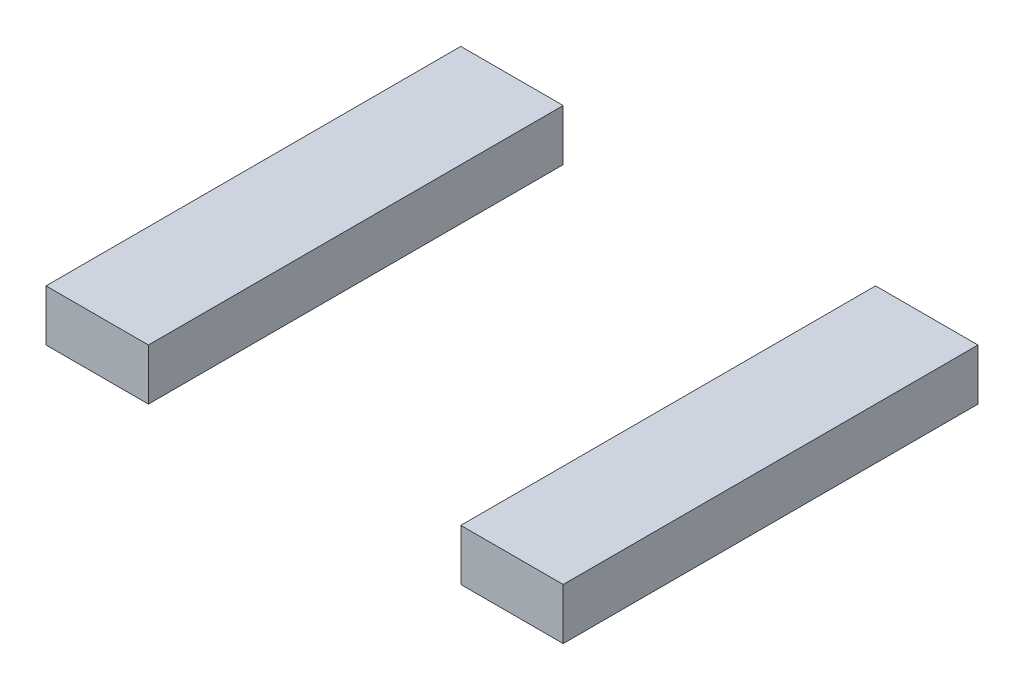
ISO-10303-21;
HEADER;
FILE_DESCRIPTION(('STEP AP214'),'2;1');
FILE_NAME('part.step','',(''),(''),'','','');
FILE_SCHEMA(('AUTOMOTIVE_DESIGN { 1 0 10303 214 1 1 1 1 }'));
ENDSEC;
DATA;
#1=APPLICATION_CONTEXT('core data for automotive mechanical design processes');
#2=APPLICATION_PROTOCOL_DEFINITION('international standard','automotive_design',2000,#1);
#3=PRODUCT_CONTEXT('',#1,'mechanical');
#4=PRODUCT('Part','Part','',(#3));
#5=PRODUCT_RELATED_PRODUCT_CATEGORY('part','',(#4));
#6=PRODUCT_DEFINITION_FORMATION('','',#4);
#7=PRODUCT_DEFINITION_CONTEXT('part definition',#1,'design');
#8=PRODUCT_DEFINITION('design','',#6,#7);
#9=PRODUCT_DEFINITION_SHAPE('','',#8);
#10=(LENGTH_UNIT() NAMED_UNIT(*) SI_UNIT(.MILLI.,.METRE.));
#11=(NAMED_UNIT(*) PLANE_ANGLE_UNIT() SI_UNIT($,.RADIAN.));
#12=(NAMED_UNIT(*) SI_UNIT($,.STERADIAN.) SOLID_ANGLE_UNIT());
#13=UNCERTAINTY_MEASURE_WITH_UNIT(LENGTH_MEASURE(1.E-05),#10,'distance_accuracy_value','');
#14=(GEOMETRIC_REPRESENTATION_CONTEXT(3) GLOBAL_UNCERTAINTY_ASSIGNED_CONTEXT((#13)) GLOBAL_UNIT_ASSIGNED_CONTEXT((#10,
#11,#12)) REPRESENTATION_CONTEXT('',''));
#15=CARTESIAN_POINT('',(0.,0.,0.));
#16=DIRECTION('',(0.,0.,1.));
#17=DIRECTION('',(1.,0.,0.));
#18=AXIS2_PLACEMENT_3D('',#15,#16,#17);
#19=CARTESIAN_POINT('',(30.5,10.,-40.5));
#20=DIRECTION('',(1.,0.,0.));
#21=DIRECTION('',(0.,0.,-1.));
#22=AXIS2_PLACEMENT_3D('',#19,#20,#21);
#23=PLANE('',#22);
#24=DIRECTION('',(0.,0.,1.));
#25=VECTOR('',#24,1.);
#26=CARTESIAN_POINT('',(30.5,0.,-40.5));
#27=LINE('',#26,#25);
#28=CARTESIAN_POINT('',(30.5,0.,-40.5));
#29=VERTEX_POINT('',#28);
#30=CARTESIAN_POINT('',(30.5,0.,40.5));
#31=VERTEX_POINT('',#30);
#32=EDGE_CURVE('E106',#29,#31,#27,.T.);
#33=ORIENTED_EDGE('',*,*,#32,.T.);
#34=DIRECTION('',(0.,-1.,0.));
#35=VECTOR('',#34,1.);
#36=CARTESIAN_POINT('',(30.5,10.,40.5));
#37=LINE('',#36,#35);
#38=CARTESIAN_POINT('',(30.5,10.,40.5));
#39=VERTEX_POINT('',#38);
#40=EDGE_CURVE('E12',#39,#31,#37,.T.);
#41=ORIENTED_EDGE('',*,*,#40,.F.);
#42=DIRECTION('',(0.,0.,1.));
#43=VECTOR('',#42,1.);
#44=CARTESIAN_POINT('',(30.5,10.,-40.5));
#45=LINE('',#44,#43);
#46=CARTESIAN_POINT('',(30.5,10.,-40.5));
#47=VERTEX_POINT('',#46);
#48=EDGE_CURVE('E94',#47,#39,#45,.T.);
#49=ORIENTED_EDGE('',*,*,#48,.F.);
#50=DIRECTION('',(0.,-1.,0.));
#51=VECTOR('',#50,1.);
#52=CARTESIAN_POINT('',(30.5,10.,-40.5));
#53=LINE('',#52,#51);
#54=EDGE_CURVE('E102',#47,#29,#53,.T.);
#55=ORIENTED_EDGE('',*,*,#54,.T.);
#56=EDGE_LOOP('',(#33,#41,#49,#55));
#57=FACE_BOUND('',#56,.T.);
#58=ADVANCED_FACE('F43',(#57),#23,.F.);
#59=CARTESIAN_POINT('',(30.5,10.,40.5));
#60=DIRECTION('',(0.,0.,-1.));
#61=DIRECTION('',(-1.,0.,0.));
#62=AXIS2_PLACEMENT_3D('',#59,#60,#61);
#63=PLANE('',#62);
#64=DIRECTION('',(1.,0.,0.));
#65=VECTOR('',#64,1.);
#66=CARTESIAN_POINT('',(30.5,0.,40.5));
#67=LINE('',#66,#65);
#68=CARTESIAN_POINT('',(50.5,0.,40.5));
#69=VERTEX_POINT('',#68);
#70=EDGE_CURVE('E98',#31,#69,#67,.T.);
#71=ORIENTED_EDGE('',*,*,#70,.T.);
#72=DIRECTION('',(0.,-1.,0.));
#73=VECTOR('',#72,1.);
#74=CARTESIAN_POINT('',(50.5,10.,40.5));
#75=LINE('',#74,#73);
#76=CARTESIAN_POINT('',(50.5,10.,40.5));
#77=VERTEX_POINT('',#76);
#78=EDGE_CURVE('E51',#77,#69,#75,.T.);
#79=ORIENTED_EDGE('',*,*,#78,.F.);
#80=DIRECTION('',(1.,0.,0.));
#81=VECTOR('',#80,1.);
#82=CARTESIAN_POINT('',(30.5,10.,40.5));
#83=LINE('',#82,#81);
#84=EDGE_CURVE('E89',#39,#77,#83,.T.);
#85=ORIENTED_EDGE('',*,*,#84,.F.);
#86=ORIENTED_EDGE('',*,*,#40,.T.);
#87=EDGE_LOOP('',(#71,#79,#85,#86));
#88=FACE_BOUND('',#87,.T.);
#89=ADVANCED_FACE('F97',(#88),#63,.F.);
#90=CARTESIAN_POINT('',(50.5,10.,-40.5));
#91=DIRECTION('',(-1.,0.,0.));
#92=DIRECTION('',(0.,0.,1.));
#93=AXIS2_PLACEMENT_3D('',#90,#91,#92);
#94=PLANE('',#93);
#95=DIRECTION('',(0.,0.,-1.));
#96=VECTOR('',#95,1.);
#97=CARTESIAN_POINT('',(50.5,0.,-40.5));
#98=LINE('',#97,#96);
#99=CARTESIAN_POINT('',(50.5,0.,-40.5));
#100=VERTEX_POINT('',#99);
#101=EDGE_CURVE('E76',#69,#100,#98,.T.);
#102=ORIENTED_EDGE('',*,*,#101,.T.);
#103=DIRECTION('',(0.,-1.,0.));
#104=VECTOR('',#103,1.);
#105=CARTESIAN_POINT('',(50.5,10.,-40.5));
#106=LINE('',#105,#104);
#107=CARTESIAN_POINT('',(50.5,10.,-40.5));
#108=VERTEX_POINT('',#107);
#109=EDGE_CURVE('E99',#108,#100,#106,.T.);
#110=ORIENTED_EDGE('',*,*,#109,.F.);
#111=DIRECTION('',(0.,0.,-1.));
#112=VECTOR('',#111,1.);
#113=CARTESIAN_POINT('',(50.5,10.,-40.5));
#114=LINE('',#113,#112);
#115=EDGE_CURVE('E92',#77,#108,#114,.T.);
#116=ORIENTED_EDGE('',*,*,#115,.F.);
#117=ORIENTED_EDGE('',*,*,#78,.T.);
#118=EDGE_LOOP('',(#102,#110,#116,#117));
#119=FACE_BOUND('',#118,.T.);
#120=ADVANCED_FACE('F100',(#119),#94,.F.);
#121=CARTESIAN_POINT('',(30.5,10.,-40.5));
#122=DIRECTION('',(0.,0.,1.));
#123=DIRECTION('',(1.,0.,0.));
#124=AXIS2_PLACEMENT_3D('',#121,#122,#123);
#125=PLANE('',#124);
#126=DIRECTION('',(-1.,0.,0.));
#127=VECTOR('',#126,1.);
#128=CARTESIAN_POINT('',(30.5,0.,-40.5));
#129=LINE('',#128,#127);
#130=EDGE_CURVE('E82',#100,#29,#129,.T.);
#131=ORIENTED_EDGE('',*,*,#130,.T.);
#132=ORIENTED_EDGE('',*,*,#54,.F.);
#133=DIRECTION('',(-1.,0.,0.));
#134=VECTOR('',#133,1.);
#135=CARTESIAN_POINT('',(30.5,10.,-40.5));
#136=LINE('',#135,#134);
#137=EDGE_CURVE('E59',#108,#47,#136,.T.);
#138=ORIENTED_EDGE('',*,*,#137,.F.);
#139=ORIENTED_EDGE('',*,*,#109,.T.);
#140=EDGE_LOOP('',(#131,#132,#138,#139));
#141=FACE_BOUND('',#140,.T.);
#142=ADVANCED_FACE('F113',(#141),#125,.F.);
#143=CARTESIAN_POINT('',(0.,10.,0.));
#144=DIRECTION('',(0.,1.,0.));
#145=DIRECTION('',(0.,0.,1.));
#146=AXIS2_PLACEMENT_3D('',#143,#144,#145);
#147=PLANE('',#146);
#148=ORIENTED_EDGE('',*,*,#48,.T.);
#149=ORIENTED_EDGE('',*,*,#84,.T.);
#150=ORIENTED_EDGE('',*,*,#115,.T.);
#151=ORIENTED_EDGE('',*,*,#137,.T.);
#152=EDGE_LOOP('',(#148,#149,#150,#151));
#153=FACE_BOUND('',#152,.T.);
#154=ADVANCED_FACE('F90',(#153),#147,.T.);
#155=CARTESIAN_POINT('',(0.,0.,0.));
#156=DIRECTION('',(0.,1.,0.));
#157=DIRECTION('',(0.,0.,1.));
#158=AXIS2_PLACEMENT_3D('',#155,#156,#157);
#159=PLANE('',#158);
#160=ORIENTED_EDGE('',*,*,#32,.F.);
#161=ORIENTED_EDGE('',*,*,#130,.F.);
#162=ORIENTED_EDGE('',*,*,#101,.F.);
#163=ORIENTED_EDGE('',*,*,#70,.F.);
#164=EDGE_LOOP('',(#160,#161,#162,#163));
#165=FACE_BOUND('',#164,.T.);
#166=ADVANCED_FACE('F116',(#165),#159,.F.);
#167=CLOSED_SHELL('',(#58,#89,#120,#142,#154,#166));
#168=MANIFOLD_SOLID_BREP('B2',#167);
#169=CARTESIAN_POINT('',(-30.5,10.,-40.5));
#170=DIRECTION('',(-1.,0.,0.));
#171=DIRECTION('',(0.,0.,1.));
#172=AXIS2_PLACEMENT_3D('',#169,#170,#171);
#173=PLANE('',#172);
#174=DIRECTION('',(0.,0.,-1.));
#175=VECTOR('',#174,1.);
#176=CARTESIAN_POINT('',(-30.5,0.,-40.5));
#177=LINE('',#176,#175);
#178=CARTESIAN_POINT('',(-30.5,0.,40.5));
#179=VERTEX_POINT('',#178);
#180=CARTESIAN_POINT('',(-30.5,0.,-40.5));
#181=VERTEX_POINT('',#180);
#182=EDGE_CURVE('E230',#179,#181,#177,.T.);
#183=ORIENTED_EDGE('',*,*,#182,.T.);
#184=DIRECTION('',(0.,-1.,0.));
#185=VECTOR('',#184,1.);
#186=CARTESIAN_POINT('',(-30.5,10.,-40.5));
#187=LINE('',#186,#185);
#188=CARTESIAN_POINT('',(-30.5,10.,-40.5));
#189=VERTEX_POINT('',#188);
#190=EDGE_CURVE('E41',#189,#181,#187,.T.);
#191=ORIENTED_EDGE('',*,*,#190,.F.);
#192=DIRECTION('',(0.,0.,-1.));
#193=VECTOR('',#192,1.);
#194=CARTESIAN_POINT('',(-30.5,10.,-40.5));
#195=LINE('',#194,#193);
#196=CARTESIAN_POINT('',(-30.5,10.,40.5));
#197=VERTEX_POINT('',#196);
#198=EDGE_CURVE('E218',#197,#189,#195,.T.);
#199=ORIENTED_EDGE('',*,*,#198,.F.);
#200=DIRECTION('',(0.,-1.,0.));
#201=VECTOR('',#200,1.);
#202=CARTESIAN_POINT('',(-30.5,10.,40.5));
#203=LINE('',#202,#201);
#204=EDGE_CURVE('E226',#197,#179,#203,.T.);
#205=ORIENTED_EDGE('',*,*,#204,.T.);
#206=EDGE_LOOP('',(#183,#191,#199,#205));
#207=FACE_BOUND('',#206,.T.);
#208=ADVANCED_FACE('F167',(#207),#173,.F.);
#209=CARTESIAN_POINT('',(-30.5,10.,-40.5));
#210=DIRECTION('',(0.,0.,1.));
#211=DIRECTION('',(1.,0.,0.));
#212=AXIS2_PLACEMENT_3D('',#209,#210,#211);
#213=PLANE('',#212);
#214=DIRECTION('',(-1.,0.,0.));
#215=VECTOR('',#214,1.);
#216=CARTESIAN_POINT('',(-30.5,0.,-40.5));
#217=LINE('',#216,#215);
#218=CARTESIAN_POINT('',(-50.5,0.,-40.5));
#219=VERTEX_POINT('',#218);
#220=EDGE_CURVE('E222',#181,#219,#217,.T.);
#221=ORIENTED_EDGE('',*,*,#220,.T.);
#222=DIRECTION('',(0.,-1.,0.));
#223=VECTOR('',#222,1.);
#224=CARTESIAN_POINT('',(-50.5,10.,-40.5));
#225=LINE('',#224,#223);
#226=CARTESIAN_POINT('',(-50.5,10.,-40.5));
#227=VERTEX_POINT('',#226);
#228=EDGE_CURVE('E175',#227,#219,#225,.T.);
#229=ORIENTED_EDGE('',*,*,#228,.F.);
#230=DIRECTION('',(-1.,0.,0.));
#231=VECTOR('',#230,1.);
#232=CARTESIAN_POINT('',(-30.5,10.,-40.5));
#233=LINE('',#232,#231);
#234=EDGE_CURVE('E213',#189,#227,#233,.T.);
#235=ORIENTED_EDGE('',*,*,#234,.F.);
#236=ORIENTED_EDGE('',*,*,#190,.T.);
#237=EDGE_LOOP('',(#221,#229,#235,#236));
#238=FACE_BOUND('',#237,.T.);
#239=ADVANCED_FACE('F221',(#238),#213,.F.);
#240=CARTESIAN_POINT('',(-50.5,10.,-40.5));
#241=DIRECTION('',(1.,0.,0.));
#242=DIRECTION('',(0.,0.,-1.));
#243=AXIS2_PLACEMENT_3D('',#240,#241,#242);
#244=PLANE('',#243);
#245=DIRECTION('',(0.,0.,1.));
#246=VECTOR('',#245,1.);
#247=CARTESIAN_POINT('',(-50.5,0.,-40.5));
#248=LINE('',#247,#246);
#249=CARTESIAN_POINT('',(-50.5,0.,40.5));
#250=VERTEX_POINT('',#249);
#251=EDGE_CURVE('E200',#219,#250,#248,.T.);
#252=ORIENTED_EDGE('',*,*,#251,.T.);
#253=DIRECTION('',(0.,-1.,0.));
#254=VECTOR('',#253,1.);
#255=CARTESIAN_POINT('',(-50.5,10.,40.5));
#256=LINE('',#255,#254);
#257=CARTESIAN_POINT('',(-50.5,10.,40.5));
#258=VERTEX_POINT('',#257);
#259=EDGE_CURVE('E223',#258,#250,#256,.T.);
#260=ORIENTED_EDGE('',*,*,#259,.F.);
#261=DIRECTION('',(0.,0.,1.));
#262=VECTOR('',#261,1.);
#263=CARTESIAN_POINT('',(-50.5,10.,-40.5));
#264=LINE('',#263,#262);
#265=EDGE_CURVE('E216',#227,#258,#264,.T.);
#266=ORIENTED_EDGE('',*,*,#265,.F.);
#267=ORIENTED_EDGE('',*,*,#228,.T.);
#268=EDGE_LOOP('',(#252,#260,#266,#267));
#269=FACE_BOUND('',#268,.T.);
#270=ADVANCED_FACE('F224',(#269),#244,.F.);
#271=CARTESIAN_POINT('',(-30.5,10.,40.5));
#272=DIRECTION('',(0.,0.,-1.));
#273=DIRECTION('',(-1.,0.,0.));
#274=AXIS2_PLACEMENT_3D('',#271,#272,#273);
#275=PLANE('',#274);
#276=DIRECTION('',(1.,0.,0.));
#277=VECTOR('',#276,1.);
#278=CARTESIAN_POINT('',(-30.5,0.,40.5));
#279=LINE('',#278,#277);
#280=EDGE_CURVE('E206',#250,#179,#279,.T.);
#281=ORIENTED_EDGE('',*,*,#280,.T.);
#282=ORIENTED_EDGE('',*,*,#204,.F.);
#283=DIRECTION('',(1.,0.,0.));
#284=VECTOR('',#283,1.);
#285=CARTESIAN_POINT('',(-30.5,10.,40.5));
#286=LINE('',#285,#284);
#287=EDGE_CURVE('E183',#258,#197,#286,.T.);
#288=ORIENTED_EDGE('',*,*,#287,.F.);
#289=ORIENTED_EDGE('',*,*,#259,.T.);
#290=EDGE_LOOP('',(#281,#282,#288,#289));
#291=FACE_BOUND('',#290,.T.);
#292=ADVANCED_FACE('F237',(#291),#275,.F.);
#293=CARTESIAN_POINT('',(0.,10.,0.));
#294=DIRECTION('',(0.,-1.,0.));
#295=DIRECTION('',(0.,0.,-1.));
#296=AXIS2_PLACEMENT_3D('',#293,#294,#295);
#297=PLANE('',#296);
#298=ORIENTED_EDGE('',*,*,#198,.T.);
#299=ORIENTED_EDGE('',*,*,#234,.T.);
#300=ORIENTED_EDGE('',*,*,#265,.T.);
#301=ORIENTED_EDGE('',*,*,#287,.T.);
#302=EDGE_LOOP('',(#298,#299,#300,#301));
#303=FACE_BOUND('',#302,.T.);
#304=ADVANCED_FACE('F214',(#303),#297,.F.);
#305=CARTESIAN_POINT('',(0.,0.,0.));
#306=DIRECTION('',(0.,-1.,0.));
#307=DIRECTION('',(0.,0.,-1.));
#308=AXIS2_PLACEMENT_3D('',#305,#306,#307);
#309=PLANE('',#308);
#310=ORIENTED_EDGE('',*,*,#182,.F.);
#311=ORIENTED_EDGE('',*,*,#280,.F.);
#312=ORIENTED_EDGE('',*,*,#251,.F.);
#313=ORIENTED_EDGE('',*,*,#220,.F.);
#314=EDGE_LOOP('',(#310,#311,#312,#313));
#315=FACE_BOUND('',#314,.T.);
#316=ADVANCED_FACE('F240',(#315),#309,.T.);
#317=CLOSED_SHELL('',(#208,#239,#270,#292,#304,#316));
#318=MANIFOLD_SOLID_BREP('B6',#317);
#319=ADVANCED_BREP_SHAPE_REPRESENTATION('',(#18,#168,#318),#14);
#320=SHAPE_DEFINITION_REPRESENTATION(#9,#319);
ENDSEC;
END-ISO-10303-21;
